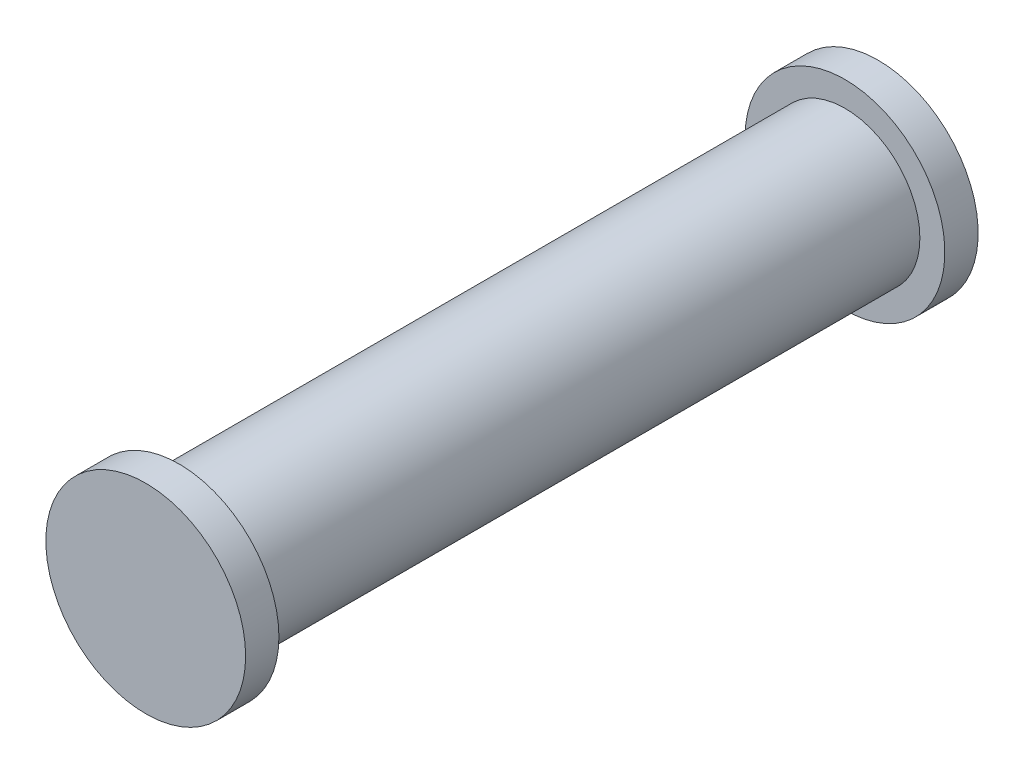
ISO-10303-21;
HEADER;
FILE_DESCRIPTION(('STEP AP214'),'2;1');
FILE_NAME('part.step','',(''),(''),'','','');
FILE_SCHEMA(('AUTOMOTIVE_DESIGN { 1 0 10303 214 1 1 1 1 }'));
ENDSEC;
DATA;
#1=APPLICATION_CONTEXT('core data for automotive mechanical design processes');
#2=APPLICATION_PROTOCOL_DEFINITION('international standard','automotive_design',2000,#1);
#3=PRODUCT_CONTEXT('',#1,'mechanical');
#4=PRODUCT('Part','Part','',(#3));
#5=PRODUCT_RELATED_PRODUCT_CATEGORY('part','',(#4));
#6=PRODUCT_DEFINITION_FORMATION('','',#4);
#7=PRODUCT_DEFINITION_CONTEXT('part definition',#1,'design');
#8=PRODUCT_DEFINITION('design','',#6,#7);
#9=PRODUCT_DEFINITION_SHAPE('','',#8);
#10=(LENGTH_UNIT() NAMED_UNIT(*) SI_UNIT(.MILLI.,.METRE.));
#11=(NAMED_UNIT(*) PLANE_ANGLE_UNIT() SI_UNIT($,.RADIAN.));
#12=(NAMED_UNIT(*) SI_UNIT($,.STERADIAN.) SOLID_ANGLE_UNIT());
#13=UNCERTAINTY_MEASURE_WITH_UNIT(LENGTH_MEASURE(1.E-05),#10,'distance_accuracy_value','');
#14=(GEOMETRIC_REPRESENTATION_CONTEXT(3) GLOBAL_UNCERTAINTY_ASSIGNED_CONTEXT((#13)) GLOBAL_UNIT_ASSIGNED_CONTEXT((#10,
#11,#12)) REPRESENTATION_CONTEXT('',''));
#15=CARTESIAN_POINT('',(0.,0.,0.));
#16=DIRECTION('',(0.,0.,1.));
#17=DIRECTION('',(1.,0.,0.));
#18=AXIS2_PLACEMENT_3D('',#15,#16,#17);
#19=CARTESIAN_POINT('',(-14.9,25.,-26.363961030679));
#20=DIRECTION('',(0.,0.,1.));
#21=DIRECTION('',(1.,0.,0.));
#22=AXIS2_PLACEMENT_3D('',#19,#20,#21);
#23=CYLINDRICAL_SURFACE('',#22,2.25);
#24=CARTESIAN_POINT('',(-14.9,25.,-20.0000000000001));
#25=DIRECTION('',(0.,0.,1.));
#26=DIRECTION('',(1.,0.,0.));
#27=AXIS2_PLACEMENT_3D('',#24,#25,#26);
#28=CIRCLE('',#27,2.25);
#29=CARTESIAN_POINT('',(-12.65,25.,-20.0000000000001));
#30=VERTEX_POINT('',#29);
#31=EDGE_CURVE('E10',#30,#30,#28,.F.);
#32=ORIENTED_EDGE('',*,*,#31,.F.);
#33=EDGE_LOOP('',(#32));
#34=FACE_BOUND('',#33,.T.);
#35=CARTESIAN_POINT('',(-14.9,25.,0.));
#36=DIRECTION('',(0.,0.,1.));
#37=DIRECTION('',(1.,0.,0.));
#38=AXIS2_PLACEMENT_3D('',#35,#36,#37);
#39=CIRCLE('',#38,2.25);
#40=CARTESIAN_POINT('',(-12.65,25.,0.));
#41=VERTEX_POINT('',#40);
#42=EDGE_CURVE('E37',#41,#41,#39,.T.);
#43=ORIENTED_EDGE('',*,*,#42,.F.);
#44=EDGE_LOOP('',(#43));
#45=FACE_BOUND('',#44,.T.);
#46=ADVANCED_FACE('F31',(#34,#45),#23,.T.);
#47=CARTESIAN_POINT('',(-14.9,25.,1.));
#48=DIRECTION('',(0.,0.,-1.));
#49=DIRECTION('',(-1.,0.,0.));
#50=AXIS2_PLACEMENT_3D('',#47,#48,#49);
#51=CYLINDRICAL_SURFACE('',#50,3.);
#52=CARTESIAN_POINT('',(-14.9,25.,1.));
#53=DIRECTION('',(0.,0.,1.));
#54=DIRECTION('',(1.,0.,0.));
#55=AXIS2_PLACEMENT_3D('',#52,#53,#54);
#56=CIRCLE('',#55,3.);
#57=CARTESIAN_POINT('',(-11.9,25.,1.));
#58=VERTEX_POINT('',#57);
#59=EDGE_CURVE('E41',#58,#58,#56,.T.);
#60=ORIENTED_EDGE('',*,*,#59,.F.);
#61=EDGE_LOOP('',(#60));
#62=FACE_BOUND('',#61,.T.);
#63=CARTESIAN_POINT('',(-14.9,25.,0.));
#64=DIRECTION('',(0.,0.,1.));
#65=DIRECTION('',(1.,0.,0.));
#66=AXIS2_PLACEMENT_3D('',#63,#64,#65);
#67=CIRCLE('',#66,3.);
#68=CARTESIAN_POINT('',(-11.9,25.,0.));
#69=VERTEX_POINT('',#68);
#70=EDGE_CURVE('E45',#69,#69,#67,.T.);
#71=ORIENTED_EDGE('',*,*,#70,.T.);
#72=EDGE_LOOP('',(#71));
#73=FACE_BOUND('',#72,.T.);
#74=ADVANCED_FACE('F74',(#62,#73),#51,.T.);
#75=CARTESIAN_POINT('',(-14.9,25.,1.));
#76=DIRECTION('',(0.,0.,1.));
#77=DIRECTION('',(1.,0.,0.));
#78=AXIS2_PLACEMENT_3D('',#75,#76,#77);
#79=PLANE('',#78);
#80=ORIENTED_EDGE('',*,*,#59,.T.);
#81=EDGE_LOOP('',(#80));
#82=FACE_BOUND('',#81,.T.);
#83=ADVANCED_FACE('F79',(#82),#79,.T.);
#84=CARTESIAN_POINT('',(-14.9,25.,0.));
#85=DIRECTION('',(0.,0.,1.));
#86=DIRECTION('',(1.,0.,0.));
#87=AXIS2_PLACEMENT_3D('',#84,#85,#86);
#88=PLANE('',#87);
#89=ORIENTED_EDGE('',*,*,#42,.T.);
#90=EDGE_LOOP('',(#89));
#91=FACE_BOUND('',#90,.T.);
#92=ORIENTED_EDGE('',*,*,#70,.F.);
#93=EDGE_LOOP('',(#92));
#94=FACE_BOUND('',#93,.T.);
#95=ADVANCED_FACE('F62',(#91,#94),#88,.F.);
#96=CARTESIAN_POINT('',(-14.9,25.,-21.0000000000001));
#97=DIRECTION('',(0.,0.,1.));
#98=DIRECTION('',(1.,0.,0.));
#99=AXIS2_PLACEMENT_3D('',#96,#97,#98);
#100=CYLINDRICAL_SURFACE('',#99,3.);
#101=CARTESIAN_POINT('',(-14.9,25.,-21.0000000000001));
#102=DIRECTION('',(0.,0.,-1.));
#103=DIRECTION('',(-1.,0.,0.));
#104=AXIS2_PLACEMENT_3D('',#101,#102,#103);
#105=CIRCLE('',#104,3.);
#106=CARTESIAN_POINT('',(-17.9,25.,-21.0000000000001));
#107=VERTEX_POINT('',#106);
#108=EDGE_CURVE('E49',#107,#107,#105,.T.);
#109=ORIENTED_EDGE('',*,*,#108,.F.);
#110=EDGE_LOOP('',(#109));
#111=FACE_BOUND('',#110,.T.);
#112=CARTESIAN_POINT('',(-14.9,25.,-20.0000000000001));
#113=DIRECTION('',(0.,0.,-1.));
#114=DIRECTION('',(-1.,0.,0.));
#115=AXIS2_PLACEMENT_3D('',#112,#113,#114);
#116=CIRCLE('',#115,3.);
#117=CARTESIAN_POINT('',(-17.9,25.,-20.0000000000001));
#118=VERTEX_POINT('',#117);
#119=EDGE_CURVE('E51',#118,#118,#116,.T.);
#120=ORIENTED_EDGE('',*,*,#119,.T.);
#121=EDGE_LOOP('',(#120));
#122=FACE_BOUND('',#121,.T.);
#123=ADVANCED_FACE('F59',(#111,#122),#100,.T.);
#124=CARTESIAN_POINT('',(-14.9,25.,-21.0000000000001));
#125=DIRECTION('',(0.,0.,-1.));
#126=DIRECTION('',(-1.,0.,0.));
#127=AXIS2_PLACEMENT_3D('',#124,#125,#126);
#128=PLANE('',#127);
#129=ORIENTED_EDGE('',*,*,#108,.T.);
#130=EDGE_LOOP('',(#129));
#131=FACE_BOUND('',#130,.T.);
#132=ADVANCED_FACE('F57',(#131),#128,.T.);
#133=CARTESIAN_POINT('',(-14.9,25.,-20.0000000000001));
#134=DIRECTION('',(0.,0.,-1.));
#135=DIRECTION('',(-1.,0.,0.));
#136=AXIS2_PLACEMENT_3D('',#133,#134,#135);
#137=PLANE('',#136);
#138=ORIENTED_EDGE('',*,*,#31,.T.);
#139=EDGE_LOOP('',(#138));
#140=FACE_BOUND('',#139,.T.);
#141=ORIENTED_EDGE('',*,*,#119,.F.);
#142=EDGE_LOOP('',(#141));
#143=FACE_BOUND('',#142,.T.);
#144=ADVANCED_FACE('F66',(#140,#143),#137,.F.);
#145=CLOSED_SHELL('',(#46,#74,#83,#95,#123,#132,#144));
#146=MANIFOLD_SOLID_BREP('B2',#145);
#147=ADVANCED_BREP_SHAPE_REPRESENTATION('',(#18,#146),#14);
#148=SHAPE_DEFINITION_REPRESENTATION(#9,#147);
ENDSEC;
END-ISO-10303-21;
